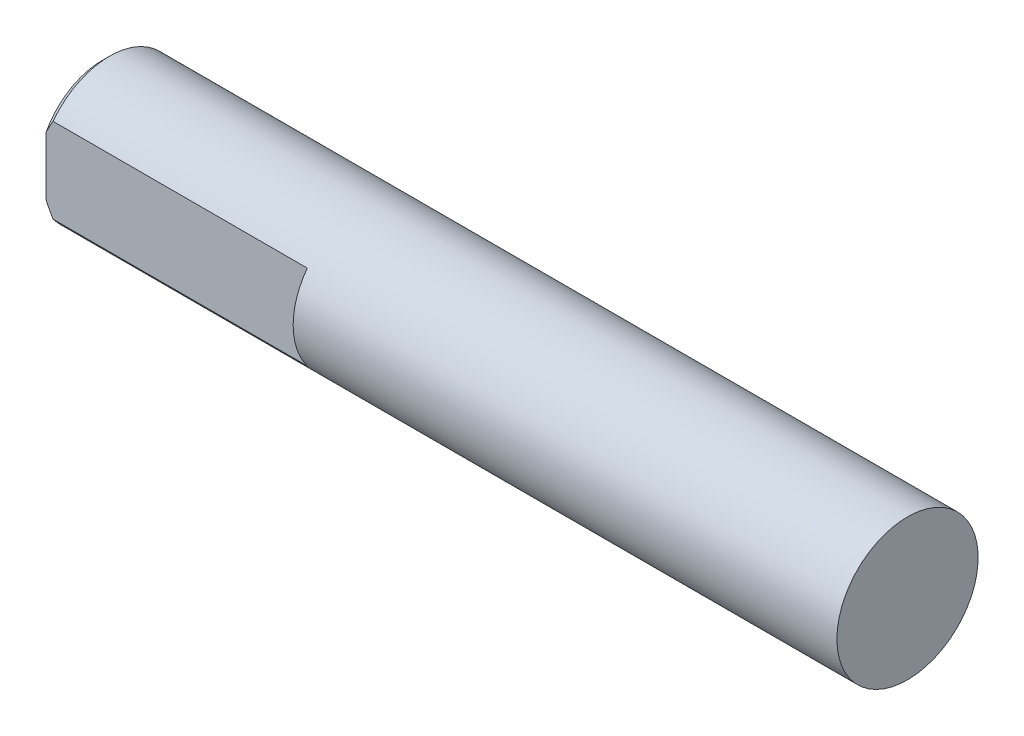
ISO-10303-21;
HEADER;
FILE_DESCRIPTION(('STEP AP214'),'2;1');
FILE_NAME('part.step','',(''),(''),'','','');
FILE_SCHEMA(('AUTOMOTIVE_DESIGN { 1 0 10303 214 1 1 1 1 }'));
ENDSEC;
DATA;
#1=APPLICATION_CONTEXT('core data for automotive mechanical design processes');
#2=APPLICATION_PROTOCOL_DEFINITION('international standard','automotive_design',2000,#1);
#3=PRODUCT_CONTEXT('',#1,'mechanical');
#4=PRODUCT('Part','Part','',(#3));
#5=PRODUCT_RELATED_PRODUCT_CATEGORY('part','',(#4));
#6=PRODUCT_DEFINITION_FORMATION('','',#4);
#7=PRODUCT_DEFINITION_CONTEXT('part definition',#1,'design');
#8=PRODUCT_DEFINITION('design','',#6,#7);
#9=PRODUCT_DEFINITION_SHAPE('','',#8);
#10=(LENGTH_UNIT() NAMED_UNIT(*) SI_UNIT(.MILLI.,.METRE.));
#11=(NAMED_UNIT(*) PLANE_ANGLE_UNIT() SI_UNIT($,.RADIAN.));
#12=(NAMED_UNIT(*) SI_UNIT($,.STERADIAN.) SOLID_ANGLE_UNIT());
#13=UNCERTAINTY_MEASURE_WITH_UNIT(LENGTH_MEASURE(1.E-05),#10,'distance_accuracy_value','');
#14=(GEOMETRIC_REPRESENTATION_CONTEXT(3) GLOBAL_UNCERTAINTY_ASSIGNED_CONTEXT((#13)) GLOBAL_UNIT_ASSIGNED_CONTEXT((#10,
#11,#12)) REPRESENTATION_CONTEXT('',''));
#15=CARTESIAN_POINT('',(0.,0.,0.));
#16=DIRECTION('',(0.,0.,1.));
#17=DIRECTION('',(1.,0.,0.));
#18=AXIS2_PLACEMENT_3D('',#15,#16,#17);
#19=CARTESIAN_POINT('',(-10.4,0.,0.));
#20=DIRECTION('',(-1.,0.,0.));
#21=DIRECTION('',(0.,0.,1.));
#22=AXIS2_PLACEMENT_3D('',#19,#20,#21);
#23=PLANE('',#22);
#24=DIRECTION('',(0.,1.,0.));
#25=VECTOR('',#24,1.);
#26=CARTESIAN_POINT('',(-10.4,0.,0.8));
#27=LINE('',#26,#25);
#28=CARTESIAN_POINT('',(-10.4000000000042,0.412310562563687,0.800000000000647));
#29=VERTEX_POINT('',#28);
#30=CARTESIAN_POINT('',(-10.4000000000021,-0.412310562568252,0.800000000000647));
#31=VERTEX_POINT('',#30);
#32=EDGE_CURVE('E63',#29,#31,#27,.F.);
#33=ORIENTED_EDGE('',*,*,#32,.F.);
#34=CARTESIAN_POINT('',(-10.4000000000042,0.,0.));
#35=DIRECTION('',(1.,0.,0.));
#36=DIRECTION('',(0.,0.,-1.));
#37=AXIS2_PLACEMENT_3D('',#34,#35,#36);
#38=CIRCLE('',#37,0.900000000001455);
#39=EDGE_CURVE('E19',#31,#29,#38,.T.);
#40=ORIENTED_EDGE('',*,*,#39,.F.);
#41=EDGE_LOOP('',(#33,#40));
#42=FACE_BOUND('',#41,.T.);
#43=ADVANCED_FACE('F16',(#42),#23,.T.);
#44=CARTESIAN_POINT('',(1.,0.,0.));
#45=DIRECTION('',(1.,0.,0.));
#46=DIRECTION('',(0.,0.,-1.));
#47=AXIS2_PLACEMENT_3D('',#44,#45,#46);
#48=PLANE('',#47);
#49=CARTESIAN_POINT('',(1.,0.,0.));
#50=DIRECTION('',(-1.,0.,0.));
#51=DIRECTION('',(0.,0.,1.));
#52=AXIS2_PLACEMENT_3D('',#49,#50,#51);
#53=CIRCLE('',#52,1.);
#54=CARTESIAN_POINT('',(1.,0.,1.));
#55=VERTEX_POINT('',#54);
#56=EDGE_CURVE('E105',#55,#55,#53,.T.);
#57=ORIENTED_EDGE('',*,*,#56,.F.);
#58=EDGE_LOOP('',(#57));
#59=FACE_BOUND('',#58,.T.);
#60=ADVANCED_FACE('F90',(#59),#48,.T.);
#61=CARTESIAN_POINT('',(-6.7,0.,0.9));
#62=DIRECTION('',(-1.,0.,0.));
#63=DIRECTION('',(0.,0.,1.));
#64=AXIS2_PLACEMENT_3D('',#61,#62,#63);
#65=PLANE('',#64);
#66=DIRECTION('',(0.,1.,0.));
#67=VECTOR('',#66,1.);
#68=CARTESIAN_POINT('',(-6.7,0.,0.8));
#69=LINE('',#68,#67);
#70=CARTESIAN_POINT('',(-6.7,-0.6,0.8));
#71=VERTEX_POINT('',#70);
#72=CARTESIAN_POINT('',(-6.7,0.6,0.8));
#73=VERTEX_POINT('',#72);
#74=EDGE_CURVE('E62',#71,#73,#69,.T.);
#75=ORIENTED_EDGE('',*,*,#74,.F.);
#76=CARTESIAN_POINT('',(-6.7,0.,0.));
#77=DIRECTION('',(-1.,0.,0.));
#78=DIRECTION('',(0.,0.,1.));
#79=AXIS2_PLACEMENT_3D('',#76,#77,#78);
#80=CIRCLE('',#79,1.);
#81=EDGE_CURVE('E70',#73,#71,#80,.F.);
#82=ORIENTED_EDGE('',*,*,#81,.F.);
#83=EDGE_LOOP('',(#75,#82));
#84=FACE_BOUND('',#83,.T.);
#85=ADVANCED_FACE('F88',(#84),#65,.T.);
#86=CARTESIAN_POINT('',(-8.55,0.,0.8));
#87=DIRECTION('',(0.,0.,1.));
#88=DIRECTION('',(1.,0.,0.));
#89=AXIS2_PLACEMENT_3D('',#86,#87,#88);
#90=PLANE('',#89);
#91=DIRECTION('',(-1.,0.,0.));
#92=VECTOR('',#91,1.);
#93=CARTESIAN_POINT('',(-4.7,-0.6,0.8));
#94=LINE('',#93,#92);
#95=CARTESIAN_POINT('',(-10.3000000000146,-0.599999999992906,0.799999999990541));
#96=VERTEX_POINT('',#95);
#97=EDGE_CURVE('E25',#71,#96,#94,.T.);
#98=ORIENTED_EDGE('',*,*,#97,.F.);
#99=ORIENTED_EDGE('',*,*,#74,.T.);
#100=DIRECTION('',(1.,0.,0.));
#101=VECTOR('',#100,1.);
#102=CARTESIAN_POINT('',(-8.55,0.6,0.8));
#103=LINE('',#102,#101);
#104=CARTESIAN_POINT('',(-10.3000000000146,0.599999999992906,0.799999999990541));
#105=VERTEX_POINT('',#104);
#106=EDGE_CURVE('E55',#73,#105,#103,.F.);
#107=ORIENTED_EDGE('',*,*,#106,.T.);
#108=CARTESIAN_POINT('',(-10.4000000000042,0.412310562562432,0.800000000001294));
#109=CARTESIAN_POINT('',(-10.3965018195199,0.419946327448474,0.79999998608051));
#110=CARTESIAN_POINT('',(-10.3929403574061,0.427552956281782,0.7999999666332));
#111=CARTESIAN_POINT('',(-10.3856458393757,0.442819684301089,0.799999945732956));
#112=CARTESIAN_POINT('',(-10.381911040753,0.450478951171047,0.799999944545953));
#113=CARTESIAN_POINT('',(-10.3742699433769,0.465855473050842,0.799999991692938));
#114=CARTESIAN_POINT('',(-10.3703619090676,0.473571864710783,0.800000040772837));
#115=CARTESIAN_POINT('',(-10.362374304118,0.489066919333117,0.800000156584079));
#116=CARTESIAN_POINT('',(-10.3582930140848,0.49684469544354,0.800000223577062));
#117=CARTESIAN_POINT('',(-10.3499588861844,0.512466507021748,0.800000332754535));
#118=CARTESIAN_POINT('',(-10.3457043544722,0.520309638218381,0.800000374528901));
#119=CARTESIAN_POINT('',(-10.3370237039875,0.536065876480839,0.800000400719829));
#120=CARTESIAN_POINT('',(-10.3325959237001,0.543978067661521,0.800000384199062));
#121=CARTESIAN_POINT('',(-10.3235687736257,0.55987587807209,0.800000291493051));
#122=CARTESIAN_POINT('',(-10.3189677808875,0.567860575015908,0.800000214334249));
#123=CARTESIAN_POINT('',(-10.3095940412986,0.58390657714745,0.800000075004708));
#124=CARTESIAN_POINT('',(-10.3048197116072,0.591966957989315,0.80000001310364));
#125=CARTESIAN_POINT('',(-10.3000000000293,0.599999999985812,0.799999999981083));
#126=B_SPLINE_CURVE_WITH_KNOTS('',3,(#108,#109,#110,#111,#112,#113,#114,#115,#116,#117,#118,
#119,#120,#121,#122,#123,#124,#125),.UNSPECIFIED.,.F.,.F.,(4,2,2,2,2,2,2,2,4),(0.,
0.0251963363601903,0.050759274511319,0.0767071167893272,0.103056885663179,0.129824375764399,
0.157024209052369,0.184669891968748,0.212773873612359),.UNSPECIFIED.);
#127=EDGE_CURVE('E57',#29,#105,#126,.T.);
#128=ORIENTED_EDGE('',*,*,#127,.F.);
#129=ORIENTED_EDGE('',*,*,#32,.T.);
#130=CARTESIAN_POINT('',(-10.3000000000293,-0.599999999985812,0.799999999981083));
#131=CARTESIAN_POINT('',(-10.3048197116072,-0.591966957989315,0.80000001310364));
#132=CARTESIAN_POINT('',(-10.3095940412986,-0.583906577147449,0.800000075004708));
#133=CARTESIAN_POINT('',(-10.3189677808875,-0.567860575015907,0.800000214334249));
#134=CARTESIAN_POINT('',(-10.3235687736257,-0.55987587807209,0.800000291493052));
#135=CARTESIAN_POINT('',(-10.3325959237001,-0.54397806766152,0.800000384199062));
#136=CARTESIAN_POINT('',(-10.3370237039875,-0.536065876480838,0.800000400719829));
#137=CARTESIAN_POINT('',(-10.3457043544722,-0.520309638218381,0.800000374528901));
#138=CARTESIAN_POINT('',(-10.3499588861844,-0.512466507021748,0.800000332754535));
#139=CARTESIAN_POINT('',(-10.3582930140848,-0.49684469544354,0.800000223577062));
#140=CARTESIAN_POINT('',(-10.362374304118,-0.489066919333116,0.800000156584079));
#141=CARTESIAN_POINT('',(-10.3703619090676,-0.473571864710782,0.800000040772837));
#142=CARTESIAN_POINT('',(-10.3742699433769,-0.465855473050842,0.799999991692938));
#143=CARTESIAN_POINT('',(-10.381911040753,-0.450478951171047,0.799999944545953));
#144=CARTESIAN_POINT('',(-10.3856458393757,-0.442819684301088,0.799999945732956));
#145=CARTESIAN_POINT('',(-10.3929403574061,-0.427552956281782,0.7999999666332));
#146=CARTESIAN_POINT('',(-10.3965018195199,-0.419946327448474,0.79999998608051));
#147=CARTESIAN_POINT('',(-10.4000000000042,-0.412310562562432,0.800000000001294));
#148=B_SPLINE_CURVE_WITH_KNOTS('',3,(#130,#131,#132,#133,#134,#135,#136,#137,#138,#139,#140,
#141,#142,#143,#144,#145,#146,#147),.UNSPECIFIED.,.F.,.F.,(4,2,2,2,2,2,2,2,4),(0.,
0.0281039816436121,0.0557496645599911,0.0829494978479607,0.109716987949181,0.136066756823033,
0.16201459910104,0.187577537252169,0.212773873612359),.UNSPECIFIED.);
#149=EDGE_CURVE('E34',#96,#31,#148,.T.);
#150=ORIENTED_EDGE('',*,*,#149,.F.);
#151=EDGE_LOOP('',(#98,#99,#107,#128,#129,#150));
#152=FACE_BOUND('',#151,.T.);
#153=ADVANCED_FACE('F61',(#152),#90,.T.);
#154=CARTESIAN_POINT('',(-10.3000000000293,0.,0.));
#155=DIRECTION('',(1.,0.,0.));
#156=DIRECTION('',(0.,0.,-1.));
#157=AXIS2_PLACEMENT_3D('',#154,#155,#156);
#158=CONICAL_SURFACE('',#157,0.999999999976353,0.785398163397448);
#159=ORIENTED_EDGE('',*,*,#149,.T.);
#160=ORIENTED_EDGE('',*,*,#39,.T.);
#161=ORIENTED_EDGE('',*,*,#127,.T.);
#162=CARTESIAN_POINT('',(-10.3,0.,0.));
#163=DIRECTION('',(-1.,0.,0.));
#164=DIRECTION('',(0.,0.,1.));
#165=AXIS2_PLACEMENT_3D('',#162,#163,#164);
#166=CIRCLE('',#165,1.);
#167=EDGE_CURVE('E10',#96,#105,#166,.F.);
#168=ORIENTED_EDGE('',*,*,#167,.F.);
#169=EDGE_LOOP('',(#159,#160,#161,#168));
#170=FACE_BOUND('',#169,.T.);
#171=ADVANCED_FACE('F58',(#170),#158,.T.);
#172=CARTESIAN_POINT('',(-4.7,0.,0.));
#173=DIRECTION('',(-1.,0.,0.));
#174=DIRECTION('',(0.,0.,1.));
#175=AXIS2_PLACEMENT_3D('',#172,#173,#174);
#176=CYLINDRICAL_SURFACE('',#175,1.);
#177=ORIENTED_EDGE('',*,*,#56,.T.);
#178=EDGE_LOOP('',(#177));
#179=FACE_BOUND('',#178,.T.);
#180=ORIENTED_EDGE('',*,*,#97,.T.);
#181=ORIENTED_EDGE('',*,*,#167,.T.);
#182=ORIENTED_EDGE('',*,*,#106,.F.);
#183=ORIENTED_EDGE('',*,*,#81,.T.);
#184=EDGE_LOOP('',(#180,#181,#182,#183));
#185=FACE_BOUND('',#184,.T.);
#186=ADVANCED_FACE('F52',(#179,#185),#176,.T.);
#187=CLOSED_SHELL('',(#43,#60,#85,#153,#171,#186));
#188=MANIFOLD_SOLID_BREP('B1',#187);
#189=ADVANCED_BREP_SHAPE_REPRESENTATION('',(#18,#188),#14);
#190=SHAPE_DEFINITION_REPRESENTATION(#9,#189);
ENDSEC;
END-ISO-10303-21;
